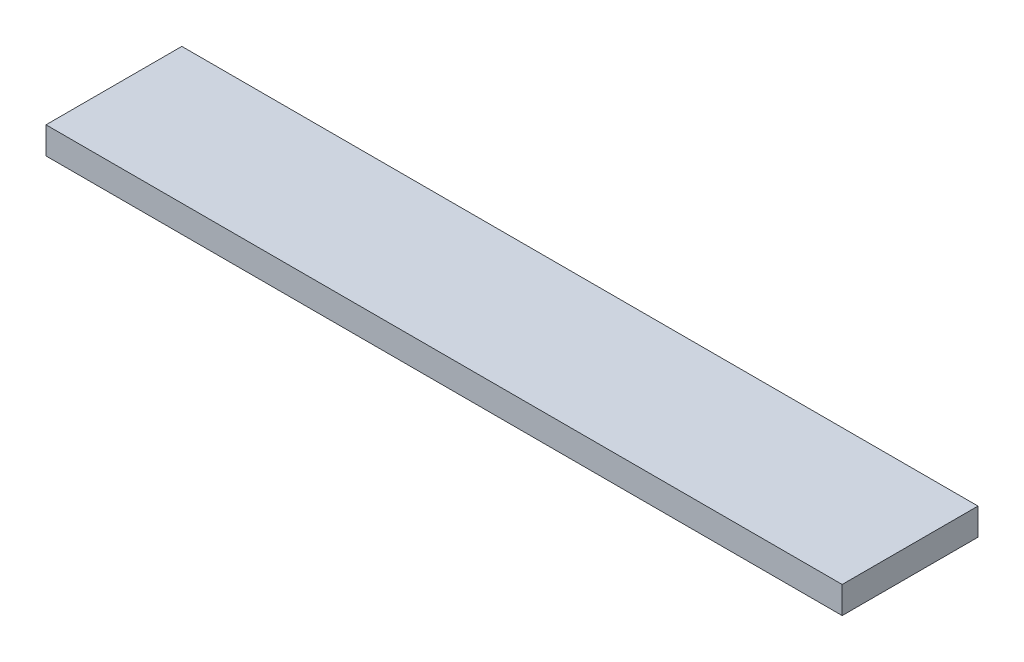
ISO-10303-21;
HEADER;
FILE_DESCRIPTION(('STEP AP214'),'2;1');
FILE_NAME('part.step','',(''),(''),'','','');
FILE_SCHEMA(('AUTOMOTIVE_DESIGN { 1 0 10303 214 1 1 1 1 }'));
ENDSEC;
DATA;
#1=APPLICATION_CONTEXT('core data for automotive mechanical design processes');
#2=APPLICATION_PROTOCOL_DEFINITION('international standard','automotive_design',2000,#1);
#3=PRODUCT_CONTEXT('',#1,'mechanical');
#4=PRODUCT('Part','Part','',(#3));
#5=PRODUCT_RELATED_PRODUCT_CATEGORY('part','',(#4));
#6=PRODUCT_DEFINITION_FORMATION('','',#4);
#7=PRODUCT_DEFINITION_CONTEXT('part definition',#1,'design');
#8=PRODUCT_DEFINITION('design','',#6,#7);
#9=PRODUCT_DEFINITION_SHAPE('','',#8);
#10=(LENGTH_UNIT() NAMED_UNIT(*) SI_UNIT(.MILLI.,.METRE.));
#11=(NAMED_UNIT(*) PLANE_ANGLE_UNIT() SI_UNIT($,.RADIAN.));
#12=(NAMED_UNIT(*) SI_UNIT($,.STERADIAN.) SOLID_ANGLE_UNIT());
#13=UNCERTAINTY_MEASURE_WITH_UNIT(LENGTH_MEASURE(1.E-05),#10,'distance_accuracy_value','');
#14=(GEOMETRIC_REPRESENTATION_CONTEXT(3) GLOBAL_UNCERTAINTY_ASSIGNED_CONTEXT((#13)) GLOBAL_UNIT_ASSIGNED_CONTEXT((#10,
#11,#12)) REPRESENTATION_CONTEXT('',''));
#15=CARTESIAN_POINT('',(0.,0.,0.));
#16=DIRECTION('',(0.,0.,1.));
#17=DIRECTION('',(1.,0.,0.));
#18=AXIS2_PLACEMENT_3D('',#15,#16,#17);
#19=CARTESIAN_POINT('',(0.,8.,0.));
#20=DIRECTION('',(1.,0.,0.));
#21=DIRECTION('',(0.,0.,-1.));
#22=AXIS2_PLACEMENT_3D('',#19,#20,#21);
#23=PLANE('',#22);
#24=DIRECTION('',(0.,0.,1.));
#25=VECTOR('',#24,1.);
#26=CARTESIAN_POINT('',(0.,0.,0.));
#27=LINE('',#26,#25);
#28=CARTESIAN_POINT('',(0.,0.,-40.26));
#29=VERTEX_POINT('',#28);
#30=CARTESIAN_POINT('',(0.,0.,0.));
#31=VERTEX_POINT('',#30);
#32=EDGE_CURVE('E102',#29,#31,#27,.T.);
#33=ORIENTED_EDGE('',*,*,#32,.T.);
#34=DIRECTION('',(0.,-1.,0.));
#35=VECTOR('',#34,1.);
#36=CARTESIAN_POINT('',(0.,8.,0.));
#37=LINE('',#36,#35);
#38=CARTESIAN_POINT('',(0.,8.,0.));
#39=VERTEX_POINT('',#38);
#40=EDGE_CURVE('E11',#39,#31,#37,.T.);
#41=ORIENTED_EDGE('',*,*,#40,.F.);
#42=DIRECTION('',(0.,0.,1.));
#43=VECTOR('',#42,1.);
#44=CARTESIAN_POINT('',(0.,8.,0.));
#45=LINE('',#44,#43);
#46=CARTESIAN_POINT('',(0.,8.,-40.26));
#47=VERTEX_POINT('',#46);
#48=EDGE_CURVE('E90',#47,#39,#45,.T.);
#49=ORIENTED_EDGE('',*,*,#48,.F.);
#50=DIRECTION('',(0.,-1.,0.));
#51=VECTOR('',#50,1.);
#52=CARTESIAN_POINT('',(0.,8.,-40.26));
#53=LINE('',#52,#51);
#54=EDGE_CURVE('E98',#47,#29,#53,.T.);
#55=ORIENTED_EDGE('',*,*,#54,.T.);
#56=EDGE_LOOP('',(#33,#41,#49,#55));
#57=FACE_BOUND('',#56,.T.);
#58=ADVANCED_FACE('F39',(#57),#23,.F.);
#59=CARTESIAN_POINT('',(0.,8.,0.));
#60=DIRECTION('',(0.,0.,-1.));
#61=DIRECTION('',(-1.,0.,0.));
#62=AXIS2_PLACEMENT_3D('',#59,#60,#61);
#63=PLANE('',#62);
#64=DIRECTION('',(1.,0.,0.));
#65=VECTOR('',#64,1.);
#66=CARTESIAN_POINT('',(0.,0.,0.));
#67=LINE('',#66,#65);
#68=CARTESIAN_POINT('',(236.,0.,0.));
#69=VERTEX_POINT('',#68);
#70=EDGE_CURVE('E94',#31,#69,#67,.T.);
#71=ORIENTED_EDGE('',*,*,#70,.T.);
#72=DIRECTION('',(0.,-1.,0.));
#73=VECTOR('',#72,1.);
#74=CARTESIAN_POINT('',(236.,8.,0.));
#75=LINE('',#74,#73);
#76=CARTESIAN_POINT('',(236.,8.,0.));
#77=VERTEX_POINT('',#76);
#78=EDGE_CURVE('E47',#77,#69,#75,.T.);
#79=ORIENTED_EDGE('',*,*,#78,.F.);
#80=DIRECTION('',(1.,0.,0.));
#81=VECTOR('',#80,1.);
#82=CARTESIAN_POINT('',(0.,8.,0.));
#83=LINE('',#82,#81);
#84=EDGE_CURVE('E85',#39,#77,#83,.T.);
#85=ORIENTED_EDGE('',*,*,#84,.F.);
#86=ORIENTED_EDGE('',*,*,#40,.T.);
#87=EDGE_LOOP('',(#71,#79,#85,#86));
#88=FACE_BOUND('',#87,.T.);
#89=ADVANCED_FACE('F93',(#88),#63,.F.);
#90=CARTESIAN_POINT('',(236.,8.,0.));
#91=DIRECTION('',(-1.,0.,0.));
#92=DIRECTION('',(0.,0.,1.));
#93=AXIS2_PLACEMENT_3D('',#90,#91,#92);
#94=PLANE('',#93);
#95=DIRECTION('',(0.,0.,-1.));
#96=VECTOR('',#95,1.);
#97=CARTESIAN_POINT('',(236.,0.,0.));
#98=LINE('',#97,#96);
#99=CARTESIAN_POINT('',(236.,0.,-40.26));
#100=VERTEX_POINT('',#99);
#101=EDGE_CURVE('E72',#69,#100,#98,.T.);
#102=ORIENTED_EDGE('',*,*,#101,.T.);
#103=DIRECTION('',(0.,-1.,0.));
#104=VECTOR('',#103,1.);
#105=CARTESIAN_POINT('',(236.,8.,-40.26));
#106=LINE('',#105,#104);
#107=CARTESIAN_POINT('',(236.,8.,-40.26));
#108=VERTEX_POINT('',#107);
#109=EDGE_CURVE('E95',#108,#100,#106,.T.);
#110=ORIENTED_EDGE('',*,*,#109,.F.);
#111=DIRECTION('',(0.,0.,-1.));
#112=VECTOR('',#111,1.);
#113=CARTESIAN_POINT('',(236.,8.,0.));
#114=LINE('',#113,#112);
#115=EDGE_CURVE('E88',#77,#108,#114,.T.);
#116=ORIENTED_EDGE('',*,*,#115,.F.);
#117=ORIENTED_EDGE('',*,*,#78,.T.);
#118=EDGE_LOOP('',(#102,#110,#116,#117));
#119=FACE_BOUND('',#118,.T.);
#120=ADVANCED_FACE('F96',(#119),#94,.F.);
#121=CARTESIAN_POINT('',(0.,8.,-40.26));
#122=DIRECTION('',(0.,0.,1.));
#123=DIRECTION('',(1.,0.,0.));
#124=AXIS2_PLACEMENT_3D('',#121,#122,#123);
#125=PLANE('',#124);
#126=DIRECTION('',(-1.,0.,0.));
#127=VECTOR('',#126,1.);
#128=CARTESIAN_POINT('',(0.,0.,-40.26));
#129=LINE('',#128,#127);
#130=EDGE_CURVE('E78',#100,#29,#129,.T.);
#131=ORIENTED_EDGE('',*,*,#130,.T.);
#132=ORIENTED_EDGE('',*,*,#54,.F.);
#133=DIRECTION('',(-1.,0.,0.));
#134=VECTOR('',#133,1.);
#135=CARTESIAN_POINT('',(0.,8.,-40.26));
#136=LINE('',#135,#134);
#137=EDGE_CURVE('E55',#108,#47,#136,.T.);
#138=ORIENTED_EDGE('',*,*,#137,.F.);
#139=ORIENTED_EDGE('',*,*,#109,.T.);
#140=EDGE_LOOP('',(#131,#132,#138,#139));
#141=FACE_BOUND('',#140,.T.);
#142=ADVANCED_FACE('F109',(#141),#125,.F.);
#143=CARTESIAN_POINT('',(0.,8.,0.));
#144=DIRECTION('',(0.,-1.,0.));
#145=DIRECTION('',(0.,0.,-1.));
#146=AXIS2_PLACEMENT_3D('',#143,#144,#145);
#147=PLANE('',#146);
#148=ORIENTED_EDGE('',*,*,#48,.T.);
#149=ORIENTED_EDGE('',*,*,#84,.T.);
#150=ORIENTED_EDGE('',*,*,#115,.T.);
#151=ORIENTED_EDGE('',*,*,#137,.T.);
#152=EDGE_LOOP('',(#148,#149,#150,#151));
#153=FACE_BOUND('',#152,.T.);
#154=ADVANCED_FACE('F86',(#153),#147,.F.);
#155=CARTESIAN_POINT('',(0.,0.,0.));
#156=DIRECTION('',(0.,-1.,0.));
#157=DIRECTION('',(0.,0.,-1.));
#158=AXIS2_PLACEMENT_3D('',#155,#156,#157);
#159=PLANE('',#158);
#160=ORIENTED_EDGE('',*,*,#32,.F.);
#161=ORIENTED_EDGE('',*,*,#130,.F.);
#162=ORIENTED_EDGE('',*,*,#101,.F.);
#163=ORIENTED_EDGE('',*,*,#70,.F.);
#164=EDGE_LOOP('',(#160,#161,#162,#163));
#165=FACE_BOUND('',#164,.T.);
#166=ADVANCED_FACE('F112',(#165),#159,.T.);
#167=CLOSED_SHELL('',(#58,#89,#120,#142,#154,#166));
#168=MANIFOLD_SOLID_BREP('B2',#167);
#169=ADVANCED_BREP_SHAPE_REPRESENTATION('',(#18,#168),#14);
#170=SHAPE_DEFINITION_REPRESENTATION(#9,#169);
ENDSEC;
END-ISO-10303-21;
